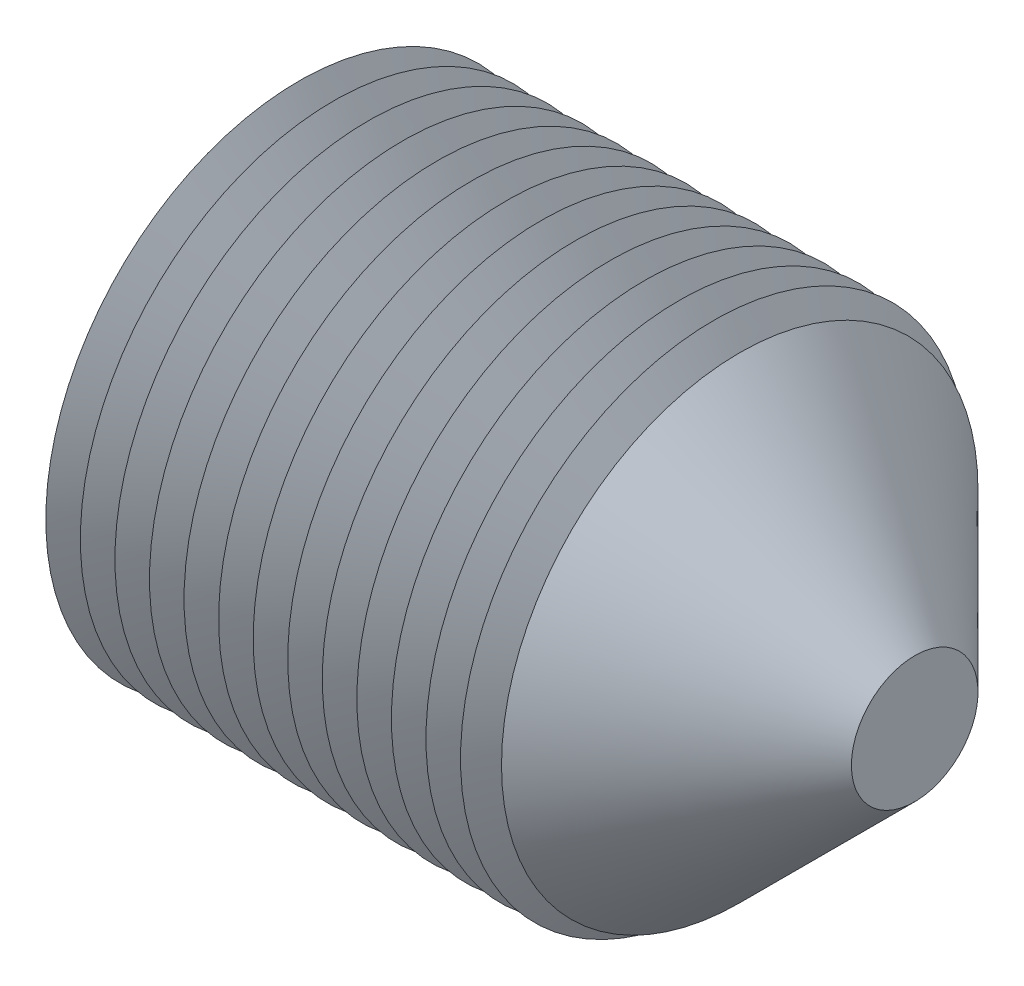
ISO-10303-21;
HEADER;
FILE_DESCRIPTION(('STEP AP214'),'2;1');
FILE_NAME('part.step','',(''),(''),'','','');
FILE_SCHEMA(('AUTOMOTIVE_DESIGN { 1 0 10303 214 1 1 1 1 }'));
ENDSEC;
DATA;
#1=APPLICATION_CONTEXT('core data for automotive mechanical design processes');
#2=APPLICATION_PROTOCOL_DEFINITION('international standard','automotive_design',2000,#1);
#3=PRODUCT_CONTEXT('',#1,'mechanical');
#4=PRODUCT('Part','Part','',(#3));
#5=PRODUCT_RELATED_PRODUCT_CATEGORY('part','',(#4));
#6=PRODUCT_DEFINITION_FORMATION('','',#4);
#7=PRODUCT_DEFINITION_CONTEXT('part definition',#1,'design');
#8=PRODUCT_DEFINITION('design','',#6,#7);
#9=PRODUCT_DEFINITION_SHAPE('','',#8);
#10=(LENGTH_UNIT() NAMED_UNIT(*) SI_UNIT(.MILLI.,.METRE.));
#11=(NAMED_UNIT(*) PLANE_ANGLE_UNIT() SI_UNIT($,.RADIAN.));
#12=(NAMED_UNIT(*) SI_UNIT($,.STERADIAN.) SOLID_ANGLE_UNIT());
#13=UNCERTAINTY_MEASURE_WITH_UNIT(LENGTH_MEASURE(1.E-05),#10,'distance_accuracy_value','');
#14=(GEOMETRIC_REPRESENTATION_CONTEXT(3) GLOBAL_UNCERTAINTY_ASSIGNED_CONTEXT((#13)) GLOBAL_UNIT_ASSIGNED_CONTEXT((#10,
#11,#12)) REPRESENTATION_CONTEXT('',''));
#15=CARTESIAN_POINT('',(0.,0.,0.));
#16=DIRECTION('',(0.,0.,1.));
#17=DIRECTION('',(1.,0.,0.));
#18=AXIS2_PLACEMENT_3D('',#15,#16,#17);
#19=CARTESIAN_POINT('',(10.,1.,0.));
#20=DIRECTION('',(1.,0.,0.));
#21=DIRECTION('',(0.,0.,-1.));
#22=AXIS2_PLACEMENT_3D('',#19,#20,#21);
#23=PLANE('',#22);
#24=CARTESIAN_POINT('',(10.,0.,0.));
#25=DIRECTION('',(1.,0.,0.));
#26=DIRECTION('',(0.,0.,-1.));
#27=AXIS2_PLACEMENT_3D('',#24,#25,#26);
#28=CIRCLE('',#27,1.);
#29=CARTESIAN_POINT('',(10.,0.,1.));
#30=VERTEX_POINT('',#29);
#31=EDGE_CURVE('E124',#30,#30,#28,.T.);
#32=ORIENTED_EDGE('',*,*,#31,.T.);
#33=EDGE_LOOP('',(#32));
#34=FACE_BOUND('',#33,.T.);
#35=ADVANCED_FACE('F33',(#34),#23,.T.);
#36=CARTESIAN_POINT('',(0.,0.,0.));
#37=DIRECTION('',(-1.,0.,0.));
#38=DIRECTION('',(0.,0.,1.));
#39=AXIS2_PLACEMENT_3D('',#36,#37,#38);
#40=PLANE('',#39);
#41=CARTESIAN_POINT('',(0.,0.,0.));
#42=DIRECTION('',(1.,0.,0.));
#43=DIRECTION('',(0.,0.,-1.));
#44=AXIS2_PLACEMENT_3D('',#41,#42,#43);
#45=CIRCLE('',#44,3.5218770039603);
#46=CARTESIAN_POINT('',(0.,0.,-3.5218770039603));
#47=VERTEX_POINT('',#46);
#48=EDGE_CURVE('E10',#47,#47,#45,.T.);
#49=ORIENTED_EDGE('',*,*,#48,.F.);
#50=EDGE_LOOP('',(#49));
#51=FACE_BOUND('',#50,.T.);
#52=ADVANCED_FACE('F141',(#51),#40,.T.);
#53=CARTESIAN_POINT('',(0.272997582349263,0.,0.));
#54=DIRECTION('',(1.,0.,0.));
#55=DIRECTION('',(0.,0.,-1.));
#56=AXIS2_PLACEMENT_3D('',#53,#54,#55);
#57=CONICAL_SURFACE('',#56,4.00000000000003,1.05199014456083);
#58=ORIENTED_EDGE('',*,*,#48,.T.);
#59=EDGE_LOOP('',(#58));
#60=FACE_BOUND('',#59,.T.);
#61=CARTESIAN_POINT('',(0.272997582349263,0.,0.));
#62=DIRECTION('',(1.,0.,0.));
#63=DIRECTION('',(0.,0.,-1.));
#64=AXIS2_PLACEMENT_3D('',#61,#62,#63);
#65=CIRCLE('',#64,4.00000000000003);
#66=CARTESIAN_POINT('',(0.272997582349263,0.,-4.00000000000003));
#67=VERTEX_POINT('',#66);
#68=EDGE_CURVE('E39',#67,#67,#65,.T.);
#69=ORIENTED_EDGE('',*,*,#68,.F.);
#70=EDGE_LOOP('',(#69));
#71=FACE_BOUND('',#70,.T.);
#72=ADVANCED_FACE('F145',(#60,#71),#57,.T.);
#73=CARTESIAN_POINT('',(0.545995164698582,0.,0.));
#74=DIRECTION('',(-1.,0.,0.));
#75=DIRECTION('',(0.,0.,1.));
#76=AXIS2_PLACEMENT_3D('',#73,#74,#75);
#77=CONICAL_SURFACE('',#76,3.5218770039603,1.05199014456074);
#78=ORIENTED_EDGE('',*,*,#68,.T.);
#79=EDGE_LOOP('',(#78));
#80=FACE_BOUND('',#79,.T.);
#81=CARTESIAN_POINT('',(0.545995164698582,0.,0.));
#82=DIRECTION('',(1.,0.,0.));
#83=DIRECTION('',(0.,0.,-1.));
#84=AXIS2_PLACEMENT_3D('',#81,#82,#83);
#85=CIRCLE('',#84,3.5218770039603);
#86=CARTESIAN_POINT('',(0.545995164698582,0.,-3.5218770039603));
#87=VERTEX_POINT('',#86);
#88=EDGE_CURVE('E43',#87,#87,#85,.T.);
#89=ORIENTED_EDGE('',*,*,#88,.F.);
#90=EDGE_LOOP('',(#89));
#91=FACE_BOUND('',#90,.T.);
#92=ADVANCED_FACE('F150',(#80,#91),#77,.T.);
#93=CARTESIAN_POINT('',(0.818992747047843,0.,0.));
#94=DIRECTION('',(1.,0.,0.));
#95=DIRECTION('',(0.,0.,-1.));
#96=AXIS2_PLACEMENT_3D('',#93,#94,#95);
#97=CONICAL_SURFACE('',#96,4.00000000000003,1.05199014456083);
#98=ORIENTED_EDGE('',*,*,#88,.T.);
#99=EDGE_LOOP('',(#98));
#100=FACE_BOUND('',#99,.T.);
#101=CARTESIAN_POINT('',(0.818992747047843,0.,0.));
#102=DIRECTION('',(1.,0.,0.));
#103=DIRECTION('',(0.,0.,-1.));
#104=AXIS2_PLACEMENT_3D('',#101,#102,#103);
#105=CIRCLE('',#104,4.00000000000003);
#106=CARTESIAN_POINT('',(0.818992747047843,0.,-4.00000000000003));
#107=VERTEX_POINT('',#106);
#108=EDGE_CURVE('E47',#107,#107,#105,.T.);
#109=ORIENTED_EDGE('',*,*,#108,.F.);
#110=EDGE_LOOP('',(#109));
#111=FACE_BOUND('',#110,.T.);
#112=ADVANCED_FACE('F155',(#100,#111),#97,.T.);
#113=CARTESIAN_POINT('',(1.09199032939716,0.,0.));
#114=DIRECTION('',(-1.,0.,0.));
#115=DIRECTION('',(0.,0.,1.));
#116=AXIS2_PLACEMENT_3D('',#113,#114,#115);
#117=CONICAL_SURFACE('',#116,3.5218770039603,1.05199014456074);
#118=ORIENTED_EDGE('',*,*,#108,.T.);
#119=EDGE_LOOP('',(#118));
#120=FACE_BOUND('',#119,.T.);
#121=CARTESIAN_POINT('',(1.09199032939716,0.,0.));
#122=DIRECTION('',(1.,0.,0.));
#123=DIRECTION('',(0.,0.,-1.));
#124=AXIS2_PLACEMENT_3D('',#121,#122,#123);
#125=CIRCLE('',#124,3.5218770039603);
#126=CARTESIAN_POINT('',(1.09199032939716,0.,-3.5218770039603));
#127=VERTEX_POINT('',#126);
#128=EDGE_CURVE('E52',#127,#127,#125,.T.);
#129=ORIENTED_EDGE('',*,*,#128,.F.);
#130=EDGE_LOOP('',(#129));
#131=FACE_BOUND('',#130,.T.);
#132=ADVANCED_FACE('F158',(#120,#131),#117,.T.);
#133=CARTESIAN_POINT('',(1.36498791174642,0.,0.));
#134=DIRECTION('',(1.,0.,0.));
#135=DIRECTION('',(0.,0.,-1.));
#136=AXIS2_PLACEMENT_3D('',#133,#134,#135);
#137=CONICAL_SURFACE('',#136,4.00000000000003,1.05199014456083);
#138=ORIENTED_EDGE('',*,*,#128,.T.);
#139=EDGE_LOOP('',(#138));
#140=FACE_BOUND('',#139,.T.);
#141=CARTESIAN_POINT('',(1.36498791174642,0.,0.));
#142=DIRECTION('',(1.,0.,0.));
#143=DIRECTION('',(0.,0.,-1.));
#144=AXIS2_PLACEMENT_3D('',#141,#142,#143);
#145=CIRCLE('',#144,4.00000000000003);
#146=CARTESIAN_POINT('',(1.36498791174642,0.,-4.00000000000003));
#147=VERTEX_POINT('',#146);
#148=EDGE_CURVE('E55',#147,#147,#145,.T.);
#149=ORIENTED_EDGE('',*,*,#148,.F.);
#150=EDGE_LOOP('',(#149));
#151=FACE_BOUND('',#150,.T.);
#152=ADVANCED_FACE('F162',(#140,#151),#137,.T.);
#153=CARTESIAN_POINT('',(1.63798549409575,0.,0.));
#154=DIRECTION('',(-1.,0.,0.));
#155=DIRECTION('',(0.,0.,1.));
#156=AXIS2_PLACEMENT_3D('',#153,#154,#155);
#157=CONICAL_SURFACE('',#156,3.5218770039603,1.05199014456074);
#158=ORIENTED_EDGE('',*,*,#148,.T.);
#159=EDGE_LOOP('',(#158));
#160=FACE_BOUND('',#159,.T.);
#161=CARTESIAN_POINT('',(1.63798549409575,0.,0.));
#162=DIRECTION('',(1.,0.,0.));
#163=DIRECTION('',(0.,0.,-1.));
#164=AXIS2_PLACEMENT_3D('',#161,#162,#163);
#165=CIRCLE('',#164,3.5218770039603);
#166=CARTESIAN_POINT('',(1.63798549409575,0.,-3.5218770039603));
#167=VERTEX_POINT('',#166);
#168=EDGE_CURVE('E58',#167,#167,#165,.T.);
#169=ORIENTED_EDGE('',*,*,#168,.F.);
#170=EDGE_LOOP('',(#169));
#171=FACE_BOUND('',#170,.T.);
#172=ADVANCED_FACE('F166',(#160,#171),#157,.T.);
#173=CARTESIAN_POINT('',(1.91098307644501,0.,0.));
#174=DIRECTION('',(1.,0.,0.));
#175=DIRECTION('',(0.,0.,-1.));
#176=AXIS2_PLACEMENT_3D('',#173,#174,#175);
#177=CONICAL_SURFACE('',#176,4.00000000000003,1.05199014456083);
#178=ORIENTED_EDGE('',*,*,#168,.T.);
#179=EDGE_LOOP('',(#178));
#180=FACE_BOUND('',#179,.T.);
#181=CARTESIAN_POINT('',(1.91098307644501,0.,0.));
#182=DIRECTION('',(1.,0.,0.));
#183=DIRECTION('',(0.,0.,-1.));
#184=AXIS2_PLACEMENT_3D('',#181,#182,#183);
#185=CIRCLE('',#184,4.00000000000003);
#186=CARTESIAN_POINT('',(1.91098307644501,0.,-4.00000000000003));
#187=VERTEX_POINT('',#186);
#188=EDGE_CURVE('E61',#187,#187,#185,.T.);
#189=ORIENTED_EDGE('',*,*,#188,.F.);
#190=EDGE_LOOP('',(#189));
#191=FACE_BOUND('',#190,.T.);
#192=ADVANCED_FACE('F170',(#180,#191),#177,.T.);
#193=CARTESIAN_POINT('',(2.18398065879432,0.,0.));
#194=DIRECTION('',(-1.,0.,0.));
#195=DIRECTION('',(0.,0.,1.));
#196=AXIS2_PLACEMENT_3D('',#193,#194,#195);
#197=CONICAL_SURFACE('',#196,3.5218770039603,1.05199014456074);
#198=ORIENTED_EDGE('',*,*,#188,.T.);
#199=EDGE_LOOP('',(#198));
#200=FACE_BOUND('',#199,.T.);
#201=CARTESIAN_POINT('',(2.18398065879432,0.,0.));
#202=DIRECTION('',(1.,0.,0.));
#203=DIRECTION('',(0.,0.,-1.));
#204=AXIS2_PLACEMENT_3D('',#201,#202,#203);
#205=CIRCLE('',#204,3.5218770039603);
#206=CARTESIAN_POINT('',(2.18398065879432,0.,-3.5218770039603));
#207=VERTEX_POINT('',#206);
#208=EDGE_CURVE('E64',#207,#207,#205,.T.);
#209=ORIENTED_EDGE('',*,*,#208,.F.);
#210=EDGE_LOOP('',(#209));
#211=FACE_BOUND('',#210,.T.);
#212=ADVANCED_FACE('F174',(#200,#211),#197,.T.);
#213=CARTESIAN_POINT('',(2.45697824114359,0.,0.));
#214=DIRECTION('',(1.,0.,0.));
#215=DIRECTION('',(0.,0.,-1.));
#216=AXIS2_PLACEMENT_3D('',#213,#214,#215);
#217=CONICAL_SURFACE('',#216,4.00000000000003,1.05199014456083);
#218=ORIENTED_EDGE('',*,*,#208,.T.);
#219=EDGE_LOOP('',(#218));
#220=FACE_BOUND('',#219,.T.);
#221=CARTESIAN_POINT('',(2.45697824114359,0.,0.));
#222=DIRECTION('',(1.,0.,0.));
#223=DIRECTION('',(0.,0.,-1.));
#224=AXIS2_PLACEMENT_3D('',#221,#222,#223);
#225=CIRCLE('',#224,4.00000000000003);
#226=CARTESIAN_POINT('',(2.45697824114359,0.,-4.00000000000003));
#227=VERTEX_POINT('',#226);
#228=EDGE_CURVE('E67',#227,#227,#225,.T.);
#229=ORIENTED_EDGE('',*,*,#228,.F.);
#230=EDGE_LOOP('',(#229));
#231=FACE_BOUND('',#230,.T.);
#232=ADVANCED_FACE('F178',(#220,#231),#217,.T.);
#233=CARTESIAN_POINT('',(2.72997582349291,0.,0.));
#234=DIRECTION('',(-1.,0.,0.));
#235=DIRECTION('',(0.,0.,1.));
#236=AXIS2_PLACEMENT_3D('',#233,#234,#235);
#237=CONICAL_SURFACE('',#236,3.5218770039603,1.05199014456074);
#238=ORIENTED_EDGE('',*,*,#228,.T.);
#239=EDGE_LOOP('',(#238));
#240=FACE_BOUND('',#239,.T.);
#241=CARTESIAN_POINT('',(2.72997582349291,0.,0.));
#242=DIRECTION('',(1.,0.,0.));
#243=DIRECTION('',(0.,0.,-1.));
#244=AXIS2_PLACEMENT_3D('',#241,#242,#243);
#245=CIRCLE('',#244,3.5218770039603);
#246=CARTESIAN_POINT('',(2.72997582349291,0.,-3.5218770039603));
#247=VERTEX_POINT('',#246);
#248=EDGE_CURVE('E70',#247,#247,#245,.T.);
#249=ORIENTED_EDGE('',*,*,#248,.F.);
#250=EDGE_LOOP('',(#249));
#251=FACE_BOUND('',#250,.T.);
#252=ADVANCED_FACE('F182',(#240,#251),#237,.T.);
#253=CARTESIAN_POINT('',(3.00297340584217,0.,0.));
#254=DIRECTION('',(1.,0.,0.));
#255=DIRECTION('',(0.,0.,-1.));
#256=AXIS2_PLACEMENT_3D('',#253,#254,#255);
#257=CONICAL_SURFACE('',#256,4.00000000000003,1.05199014456083);
#258=ORIENTED_EDGE('',*,*,#248,.T.);
#259=EDGE_LOOP('',(#258));
#260=FACE_BOUND('',#259,.T.);
#261=CARTESIAN_POINT('',(3.00297340584217,0.,0.));
#262=DIRECTION('',(1.,0.,0.));
#263=DIRECTION('',(0.,0.,-1.));
#264=AXIS2_PLACEMENT_3D('',#261,#262,#263);
#265=CIRCLE('',#264,4.00000000000003);
#266=CARTESIAN_POINT('',(3.00297340584217,0.,-4.00000000000003));
#267=VERTEX_POINT('',#266);
#268=EDGE_CURVE('E73',#267,#267,#265,.T.);
#269=ORIENTED_EDGE('',*,*,#268,.F.);
#270=EDGE_LOOP('',(#269));
#271=FACE_BOUND('',#270,.T.);
#272=ADVANCED_FACE('F186',(#260,#271),#257,.T.);
#273=CARTESIAN_POINT('',(3.27597098819149,0.,0.));
#274=DIRECTION('',(-1.,0.,0.));
#275=DIRECTION('',(0.,0.,1.));
#276=AXIS2_PLACEMENT_3D('',#273,#274,#275);
#277=CONICAL_SURFACE('',#276,3.5218770039603,1.05199014456074);
#278=ORIENTED_EDGE('',*,*,#268,.T.);
#279=EDGE_LOOP('',(#278));
#280=FACE_BOUND('',#279,.T.);
#281=CARTESIAN_POINT('',(3.27597098819149,0.,0.));
#282=DIRECTION('',(1.,0.,0.));
#283=DIRECTION('',(0.,0.,-1.));
#284=AXIS2_PLACEMENT_3D('',#281,#282,#283);
#285=CIRCLE('',#284,3.5218770039603);
#286=CARTESIAN_POINT('',(3.27597098819149,0.,-3.5218770039603));
#287=VERTEX_POINT('',#286);
#288=EDGE_CURVE('E76',#287,#287,#285,.T.);
#289=ORIENTED_EDGE('',*,*,#288,.F.);
#290=EDGE_LOOP('',(#289));
#291=FACE_BOUND('',#290,.T.);
#292=ADVANCED_FACE('F190',(#280,#291),#277,.T.);
#293=CARTESIAN_POINT('',(3.54896857054075,0.,0.));
#294=DIRECTION('',(1.,0.,0.));
#295=DIRECTION('',(0.,0.,-1.));
#296=AXIS2_PLACEMENT_3D('',#293,#294,#295);
#297=CONICAL_SURFACE('',#296,4.00000000000003,1.05199014456083);
#298=ORIENTED_EDGE('',*,*,#288,.T.);
#299=EDGE_LOOP('',(#298));
#300=FACE_BOUND('',#299,.T.);
#301=CARTESIAN_POINT('',(3.54896857054075,0.,0.));
#302=DIRECTION('',(1.,0.,0.));
#303=DIRECTION('',(0.,0.,-1.));
#304=AXIS2_PLACEMENT_3D('',#301,#302,#303);
#305=CIRCLE('',#304,4.00000000000003);
#306=CARTESIAN_POINT('',(3.54896857054075,0.,-4.00000000000003));
#307=VERTEX_POINT('',#306);
#308=EDGE_CURVE('E79',#307,#307,#305,.T.);
#309=ORIENTED_EDGE('',*,*,#308,.F.);
#310=EDGE_LOOP('',(#309));
#311=FACE_BOUND('',#310,.T.);
#312=ADVANCED_FACE('F194',(#300,#311),#297,.T.);
#313=CARTESIAN_POINT('',(3.82196615289007,0.,0.));
#314=DIRECTION('',(-1.,0.,0.));
#315=DIRECTION('',(0.,0.,1.));
#316=AXIS2_PLACEMENT_3D('',#313,#314,#315);
#317=CONICAL_SURFACE('',#316,3.5218770039603,1.05199014456074);
#318=ORIENTED_EDGE('',*,*,#308,.T.);
#319=EDGE_LOOP('',(#318));
#320=FACE_BOUND('',#319,.T.);
#321=CARTESIAN_POINT('',(3.82196615289007,0.,0.));
#322=DIRECTION('',(1.,0.,0.));
#323=DIRECTION('',(0.,0.,-1.));
#324=AXIS2_PLACEMENT_3D('',#321,#322,#323);
#325=CIRCLE('',#324,3.5218770039603);
#326=CARTESIAN_POINT('',(3.82196615289007,0.,-3.5218770039603));
#327=VERTEX_POINT('',#326);
#328=EDGE_CURVE('E82',#327,#327,#325,.T.);
#329=ORIENTED_EDGE('',*,*,#328,.F.);
#330=EDGE_LOOP('',(#329));
#331=FACE_BOUND('',#330,.T.);
#332=ADVANCED_FACE('F198',(#320,#331),#317,.T.);
#333=CARTESIAN_POINT('',(4.09496373523933,0.,0.));
#334=DIRECTION('',(1.,0.,0.));
#335=DIRECTION('',(0.,0.,-1.));
#336=AXIS2_PLACEMENT_3D('',#333,#334,#335);
#337=CONICAL_SURFACE('',#336,4.00000000000003,1.05199014456083);
#338=ORIENTED_EDGE('',*,*,#328,.T.);
#339=EDGE_LOOP('',(#338));
#340=FACE_BOUND('',#339,.T.);
#341=CARTESIAN_POINT('',(4.09496373523933,0.,0.));
#342=DIRECTION('',(1.,0.,0.));
#343=DIRECTION('',(0.,0.,-1.));
#344=AXIS2_PLACEMENT_3D('',#341,#342,#343);
#345=CIRCLE('',#344,4.00000000000003);
#346=CARTESIAN_POINT('',(4.09496373523933,0.,-4.00000000000003));
#347=VERTEX_POINT('',#346);
#348=EDGE_CURVE('E85',#347,#347,#345,.T.);
#349=ORIENTED_EDGE('',*,*,#348,.F.);
#350=EDGE_LOOP('',(#349));
#351=FACE_BOUND('',#350,.T.);
#352=ADVANCED_FACE('F202',(#340,#351),#337,.T.);
#353=CARTESIAN_POINT('',(4.36796131758865,0.,0.));
#354=DIRECTION('',(-1.,0.,0.));
#355=DIRECTION('',(0.,0.,1.));
#356=AXIS2_PLACEMENT_3D('',#353,#354,#355);
#357=CONICAL_SURFACE('',#356,3.5218770039603,1.05199014456074);
#358=ORIENTED_EDGE('',*,*,#348,.T.);
#359=EDGE_LOOP('',(#358));
#360=FACE_BOUND('',#359,.T.);
#361=CARTESIAN_POINT('',(4.36796131758865,0.,0.));
#362=DIRECTION('',(1.,0.,0.));
#363=DIRECTION('',(0.,0.,-1.));
#364=AXIS2_PLACEMENT_3D('',#361,#362,#363);
#365=CIRCLE('',#364,3.5218770039603);
#366=CARTESIAN_POINT('',(4.36796131758865,0.,-3.5218770039603));
#367=VERTEX_POINT('',#366);
#368=EDGE_CURVE('E88',#367,#367,#365,.T.);
#369=ORIENTED_EDGE('',*,*,#368,.F.);
#370=EDGE_LOOP('',(#369));
#371=FACE_BOUND('',#370,.T.);
#372=ADVANCED_FACE('F206',(#360,#371),#357,.T.);
#373=CARTESIAN_POINT('',(4.64095889993791,0.,0.));
#374=DIRECTION('',(1.,0.,0.));
#375=DIRECTION('',(0.,0.,-1.));
#376=AXIS2_PLACEMENT_3D('',#373,#374,#375);
#377=CONICAL_SURFACE('',#376,4.00000000000003,1.05199014456083);
#378=ORIENTED_EDGE('',*,*,#368,.T.);
#379=EDGE_LOOP('',(#378));
#380=FACE_BOUND('',#379,.T.);
#381=CARTESIAN_POINT('',(4.64095889993791,0.,0.));
#382=DIRECTION('',(1.,0.,0.));
#383=DIRECTION('',(0.,0.,-1.));
#384=AXIS2_PLACEMENT_3D('',#381,#382,#383);
#385=CIRCLE('',#384,4.00000000000003);
#386=CARTESIAN_POINT('',(4.64095889993791,0.,-4.00000000000003));
#387=VERTEX_POINT('',#386);
#388=EDGE_CURVE('E91',#387,#387,#385,.T.);
#389=ORIENTED_EDGE('',*,*,#388,.F.);
#390=EDGE_LOOP('',(#389));
#391=FACE_BOUND('',#390,.T.);
#392=ADVANCED_FACE('F210',(#380,#391),#377,.T.);
#393=CARTESIAN_POINT('',(4.91395648228723,0.,0.));
#394=DIRECTION('',(-1.,0.,0.));
#395=DIRECTION('',(0.,0.,1.));
#396=AXIS2_PLACEMENT_3D('',#393,#394,#395);
#397=CONICAL_SURFACE('',#396,3.5218770039603,1.05199014456074);
#398=ORIENTED_EDGE('',*,*,#388,.T.);
#399=EDGE_LOOP('',(#398));
#400=FACE_BOUND('',#399,.T.);
#401=CARTESIAN_POINT('',(4.91395648228723,0.,0.));
#402=DIRECTION('',(1.,0.,0.));
#403=DIRECTION('',(0.,0.,-1.));
#404=AXIS2_PLACEMENT_3D('',#401,#402,#403);
#405=CIRCLE('',#404,3.5218770039603);
#406=CARTESIAN_POINT('',(4.91395648228723,0.,-3.5218770039603));
#407=VERTEX_POINT('',#406);
#408=EDGE_CURVE('E94',#407,#407,#405,.T.);
#409=ORIENTED_EDGE('',*,*,#408,.F.);
#410=EDGE_LOOP('',(#409));
#411=FACE_BOUND('',#410,.T.);
#412=ADVANCED_FACE('F214',(#400,#411),#397,.T.);
#413=CARTESIAN_POINT('',(5.1869540646365,0.,0.));
#414=DIRECTION('',(1.,0.,0.));
#415=DIRECTION('',(0.,0.,-1.));
#416=AXIS2_PLACEMENT_3D('',#413,#414,#415);
#417=CONICAL_SURFACE('',#416,4.00000000000003,1.05199014456083);
#418=ORIENTED_EDGE('',*,*,#408,.T.);
#419=EDGE_LOOP('',(#418));
#420=FACE_BOUND('',#419,.T.);
#421=CARTESIAN_POINT('',(5.1869540646365,0.,0.));
#422=DIRECTION('',(1.,0.,0.));
#423=DIRECTION('',(0.,0.,-1.));
#424=AXIS2_PLACEMENT_3D('',#421,#422,#423);
#425=CIRCLE('',#424,4.00000000000003);
#426=CARTESIAN_POINT('',(5.1869540646365,0.,-4.00000000000003));
#427=VERTEX_POINT('',#426);
#428=EDGE_CURVE('E97',#427,#427,#425,.T.);
#429=ORIENTED_EDGE('',*,*,#428,.F.);
#430=EDGE_LOOP('',(#429));
#431=FACE_BOUND('',#430,.T.);
#432=ADVANCED_FACE('F218',(#420,#431),#417,.T.);
#433=CARTESIAN_POINT('',(5.45995164698582,0.,0.));
#434=DIRECTION('',(-1.,0.,0.));
#435=DIRECTION('',(0.,0.,1.));
#436=AXIS2_PLACEMENT_3D('',#433,#434,#435);
#437=CONICAL_SURFACE('',#436,3.5218770039603,1.05199014456074);
#438=ORIENTED_EDGE('',*,*,#428,.T.);
#439=EDGE_LOOP('',(#438));
#440=FACE_BOUND('',#439,.T.);
#441=CARTESIAN_POINT('',(5.45995164698582,0.,0.));
#442=DIRECTION('',(1.,0.,0.));
#443=DIRECTION('',(0.,0.,-1.));
#444=AXIS2_PLACEMENT_3D('',#441,#442,#443);
#445=CIRCLE('',#444,3.5218770039603);
#446=CARTESIAN_POINT('',(5.45995164698582,0.,-3.5218770039603));
#447=VERTEX_POINT('',#446);
#448=EDGE_CURVE('E100',#447,#447,#445,.T.);
#449=ORIENTED_EDGE('',*,*,#448,.F.);
#450=EDGE_LOOP('',(#449));
#451=FACE_BOUND('',#450,.T.);
#452=ADVANCED_FACE('F222',(#440,#451),#437,.T.);
#453=CARTESIAN_POINT('',(5.73294922933508,0.,0.));
#454=DIRECTION('',(1.,0.,0.));
#455=DIRECTION('',(0.,0.,-1.));
#456=AXIS2_PLACEMENT_3D('',#453,#454,#455);
#457=CONICAL_SURFACE('',#456,4.00000000000003,1.05199014456083);
#458=ORIENTED_EDGE('',*,*,#448,.T.);
#459=EDGE_LOOP('',(#458));
#460=FACE_BOUND('',#459,.T.);
#461=CARTESIAN_POINT('',(5.73294922933508,0.,0.));
#462=DIRECTION('',(1.,0.,0.));
#463=DIRECTION('',(0.,0.,-1.));
#464=AXIS2_PLACEMENT_3D('',#461,#462,#463);
#465=CIRCLE('',#464,4.00000000000003);
#466=CARTESIAN_POINT('',(5.73294922933508,0.,-4.00000000000003));
#467=VERTEX_POINT('',#466);
#468=EDGE_CURVE('E103',#467,#467,#465,.T.);
#469=ORIENTED_EDGE('',*,*,#468,.F.);
#470=EDGE_LOOP('',(#469));
#471=FACE_BOUND('',#470,.T.);
#472=ADVANCED_FACE('F226',(#460,#471),#457,.T.);
#473=CARTESIAN_POINT('',(6.0059468116844,0.,0.));
#474=DIRECTION('',(-1.,0.,0.));
#475=DIRECTION('',(0.,0.,1.));
#476=AXIS2_PLACEMENT_3D('',#473,#474,#475);
#477=CONICAL_SURFACE('',#476,3.5218770039603,1.05199014456074);
#478=ORIENTED_EDGE('',*,*,#468,.T.);
#479=EDGE_LOOP('',(#478));
#480=FACE_BOUND('',#479,.T.);
#481=CARTESIAN_POINT('',(6.0059468116844,0.,0.));
#482=DIRECTION('',(1.,0.,0.));
#483=DIRECTION('',(0.,0.,-1.));
#484=AXIS2_PLACEMENT_3D('',#481,#482,#483);
#485=CIRCLE('',#484,3.5218770039603);
#486=CARTESIAN_POINT('',(6.0059468116844,0.,-3.5218770039603));
#487=VERTEX_POINT('',#486);
#488=EDGE_CURVE('E106',#487,#487,#485,.T.);
#489=ORIENTED_EDGE('',*,*,#488,.F.);
#490=EDGE_LOOP('',(#489));
#491=FACE_BOUND('',#490,.T.);
#492=ADVANCED_FACE('F230',(#480,#491),#477,.T.);
#493=CARTESIAN_POINT('',(6.27894439403366,0.,0.));
#494=DIRECTION('',(1.,0.,0.));
#495=DIRECTION('',(0.,0.,-1.));
#496=AXIS2_PLACEMENT_3D('',#493,#494,#495);
#497=CONICAL_SURFACE('',#496,4.00000000000003,1.05199014456083);
#498=ORIENTED_EDGE('',*,*,#488,.T.);
#499=EDGE_LOOP('',(#498));
#500=FACE_BOUND('',#499,.T.);
#501=CARTESIAN_POINT('',(6.27894439403366,0.,0.));
#502=DIRECTION('',(1.,0.,0.));
#503=DIRECTION('',(0.,0.,-1.));
#504=AXIS2_PLACEMENT_3D('',#501,#502,#503);
#505=CIRCLE('',#504,4.00000000000003);
#506=CARTESIAN_POINT('',(6.27894439403366,0.,-4.00000000000003));
#507=VERTEX_POINT('',#506);
#508=EDGE_CURVE('E109',#507,#507,#505,.T.);
#509=ORIENTED_EDGE('',*,*,#508,.F.);
#510=EDGE_LOOP('',(#509));
#511=FACE_BOUND('',#510,.T.);
#512=ADVANCED_FACE('F234',(#500,#511),#497,.T.);
#513=CARTESIAN_POINT('',(6.55194197638298,0.,0.));
#514=DIRECTION('',(-1.,0.,0.));
#515=DIRECTION('',(0.,0.,1.));
#516=AXIS2_PLACEMENT_3D('',#513,#514,#515);
#517=CONICAL_SURFACE('',#516,3.5218770039603,1.05199014456074);
#518=ORIENTED_EDGE('',*,*,#508,.T.);
#519=EDGE_LOOP('',(#518));
#520=FACE_BOUND('',#519,.T.);
#521=CARTESIAN_POINT('',(6.55194197638298,0.,0.));
#522=DIRECTION('',(1.,0.,0.));
#523=DIRECTION('',(0.,0.,-1.));
#524=AXIS2_PLACEMENT_3D('',#521,#522,#523);
#525=CIRCLE('',#524,3.5218770039603);
#526=CARTESIAN_POINT('',(6.55194197638298,0.,-3.5218770039603));
#527=VERTEX_POINT('',#526);
#528=EDGE_CURVE('E112',#527,#527,#525,.T.);
#529=ORIENTED_EDGE('',*,*,#528,.F.);
#530=EDGE_LOOP('',(#529));
#531=FACE_BOUND('',#530,.T.);
#532=ADVANCED_FACE('F238',(#520,#531),#517,.T.);
#533=CARTESIAN_POINT('',(6.82493955873224,0.,0.));
#534=DIRECTION('',(1.,0.,0.));
#535=DIRECTION('',(0.,0.,-1.));
#536=AXIS2_PLACEMENT_3D('',#533,#534,#535);
#537=CONICAL_SURFACE('',#536,4.00000000000003,1.05199014456083);
#538=ORIENTED_EDGE('',*,*,#528,.T.);
#539=EDGE_LOOP('',(#538));
#540=FACE_BOUND('',#539,.T.);
#541=CARTESIAN_POINT('',(6.82493955873224,0.,0.));
#542=DIRECTION('',(1.,0.,0.));
#543=DIRECTION('',(0.,0.,-1.));
#544=AXIS2_PLACEMENT_3D('',#541,#542,#543);
#545=CIRCLE('',#544,4.00000000000003);
#546=CARTESIAN_POINT('',(6.82493955873224,0.,-4.00000000000003));
#547=VERTEX_POINT('',#546);
#548=EDGE_CURVE('E115',#547,#547,#545,.T.);
#549=ORIENTED_EDGE('',*,*,#548,.F.);
#550=EDGE_LOOP('',(#549));
#551=FACE_BOUND('',#550,.T.);
#552=ADVANCED_FACE('F242',(#540,#551),#537,.T.);
#553=CARTESIAN_POINT('',(7.09793714108156,0.,0.));
#554=DIRECTION('',(-1.,0.,0.));
#555=DIRECTION('',(0.,0.,1.));
#556=AXIS2_PLACEMENT_3D('',#553,#554,#555);
#557=CONICAL_SURFACE('',#556,3.5218770039603,1.05199014456074);
#558=ORIENTED_EDGE('',*,*,#548,.T.);
#559=EDGE_LOOP('',(#558));
#560=FACE_BOUND('',#559,.T.);
#561=CARTESIAN_POINT('',(7.09793714108156,0.,0.));
#562=DIRECTION('',(1.,0.,0.));
#563=DIRECTION('',(0.,0.,-1.));
#564=AXIS2_PLACEMENT_3D('',#561,#562,#563);
#565=CIRCLE('',#564,3.5218770039603);
#566=CARTESIAN_POINT('',(7.09793714108156,0.,-3.5218770039603));
#567=VERTEX_POINT('',#566);
#568=EDGE_CURVE('E118',#567,#567,#565,.T.);
#569=ORIENTED_EDGE('',*,*,#568,.F.);
#570=EDGE_LOOP('',(#569));
#571=FACE_BOUND('',#570,.T.);
#572=ADVANCED_FACE('F137',(#560,#571),#557,.T.);
#573=CARTESIAN_POINT('',(7.2361171114261,0.,0.));
#574=DIRECTION('',(1.,0.,0.));
#575=DIRECTION('',(0.,0.,-1.));
#576=AXIS2_PLACEMENT_3D('',#573,#574,#575);
#577=CONICAL_SURFACE('',#576,3.7638828885739,1.05199014456081);
#578=ORIENTED_EDGE('',*,*,#568,.T.);
#579=EDGE_LOOP('',(#578));
#580=FACE_BOUND('',#579,.T.);
#581=CARTESIAN_POINT('',(7.2361171114261,0.,0.));
#582=DIRECTION('',(1.,0.,0.));
#583=DIRECTION('',(0.,0.,-1.));
#584=AXIS2_PLACEMENT_3D('',#581,#582,#583);
#585=CIRCLE('',#584,3.7638828885739);
#586=CARTESIAN_POINT('',(7.2361171114261,0.,3.7638828885739));
#587=VERTEX_POINT('',#586);
#588=EDGE_CURVE('E121',#587,#587,#585,.T.);
#589=ORIENTED_EDGE('',*,*,#588,.F.);
#590=EDGE_LOOP('',(#589));
#591=FACE_BOUND('',#590,.T.);
#592=ADVANCED_FACE('F131',(#580,#591),#577,.T.);
#593=CARTESIAN_POINT('',(10.,0.,0.));
#594=DIRECTION('',(-1.,0.,0.));
#595=DIRECTION('',(0.,0.,1.));
#596=AXIS2_PLACEMENT_3D('',#593,#594,#595);
#597=CONICAL_SURFACE('',#596,1.,0.785398163397448);
#598=CARTESIAN_POINT('',(7.2361171114261,0.,3.7638828885739));
#599=CARTESIAN_POINT('',(7.26490755818208,0.,3.73509244181792));
#600=CARTESIAN_POINT('',(7.29369800493805,0.,3.70630199506195));
#601=CARTESIAN_POINT('',(7.35127889845001,0.,3.64872110154999));
#602=CARTESIAN_POINT('',(7.38006934520599,0.,3.61993065479401));
#603=CARTESIAN_POINT('',(7.43765023871794,0.,3.56234976128206));
#604=CARTESIAN_POINT('',(7.46644068547392,0.,3.53355931452608));
#605=CARTESIAN_POINT('',(7.52402157898588,0.,3.47597842101412));
#606=CARTESIAN_POINT('',(7.55281202574186,0.,3.44718797425814));
#607=CARTESIAN_POINT('',(7.61039291925381,0.,3.38960708074619));
#608=CARTESIAN_POINT('',(7.63918336600979,0.,3.36081663399021));
#609=CARTESIAN_POINT('',(7.69676425952175,0.,3.30323574047825));
#610=CARTESIAN_POINT('',(7.72555470627773,0.,3.27444529372227));
#611=CARTESIAN_POINT('',(7.78313559978968,0.,3.21686440021032));
#612=CARTESIAN_POINT('',(7.81192604654566,0.,3.18807395345434));
#613=CARTESIAN_POINT('',(7.86950694005762,0.,3.13049305994238));
#614=CARTESIAN_POINT('',(7.89829738681359,0.,3.10170261318641));
#615=CARTESIAN_POINT('',(7.95587828032555,0.,3.04412171967445));
#616=CARTESIAN_POINT('',(7.98466872708153,0.,3.01533127291847));
#617=CARTESIAN_POINT('',(8.04224962059349,0.,2.95775037940651));
#618=CARTESIAN_POINT('',(8.07104006734946,0.,2.92895993265054));
#619=CARTESIAN_POINT('',(8.12862096086142,0.,2.87137903913858));
#620=CARTESIAN_POINT('',(8.1574114076174,0.,2.8425885923826));
#621=CARTESIAN_POINT('',(8.21499230112935,0.,2.78500769887065));
#622=CARTESIAN_POINT('',(8.24378274788533,0.,2.75621725211467));
#623=CARTESIAN_POINT('',(8.30136364139729,0.,2.69863635860271));
#624=CARTESIAN_POINT('',(8.33015408815327,0.,2.66984591184673));
#625=CARTESIAN_POINT('',(8.38773498166522,0.,2.61226501833478));
#626=CARTESIAN_POINT('',(8.4165254284212,0.,2.5834745715788));
#627=CARTESIAN_POINT('',(8.47410632193316,0.,2.52589367806684));
#628=CARTESIAN_POINT('',(8.50289676868913,0.,2.49710323131086));
#629=CARTESIAN_POINT('',(8.56047766220109,0.,2.43952233779891));
#630=CARTESIAN_POINT('',(8.58926810895707,0.,2.41073189104293));
#631=CARTESIAN_POINT('',(8.64684900246903,0.,2.35315099753097));
#632=CARTESIAN_POINT('',(8.675639449225,0.,2.324360550775));
#633=CARTESIAN_POINT('',(8.73322034273696,0.,2.26677965726304));
#634=CARTESIAN_POINT('',(8.76201078949294,0.,2.23798921050706));
#635=CARTESIAN_POINT('',(8.8195916830049,0.,2.1804083169951));
#636=CARTESIAN_POINT('',(8.84838212976087,0.,2.15161787023913));
#637=CARTESIAN_POINT('',(8.90596302327283,0.,2.09403697672717));
#638=CARTESIAN_POINT('',(8.93475347002881,0.,2.06524652997119));
#639=CARTESIAN_POINT('',(8.99233436354077,0.,2.00766563645924));
#640=CARTESIAN_POINT('',(9.02112481029674,0.,1.97887518970326));
#641=CARTESIAN_POINT('',(9.0787057038087,0.,1.9212942961913));
#642=CARTESIAN_POINT('',(9.10749615056468,0.,1.89250384943532));
#643=CARTESIAN_POINT('',(9.16507704407663,0.,1.83492295592337));
#644=CARTESIAN_POINT('',(9.19386749083261,0.,1.80613250916739));
#645=CARTESIAN_POINT('',(9.25144838434457,0.,1.74855161565543));
#646=CARTESIAN_POINT('',(9.28023883110055,0.,1.71976116889945));
#647=CARTESIAN_POINT('',(9.3378197246125,0.,1.6621802753875));
#648=CARTESIAN_POINT('',(9.36661017136848,0.,1.63338982863152));
#649=CARTESIAN_POINT('',(9.42419106488044,0.,1.57580893511956));
#650=CARTESIAN_POINT('',(9.45298151163641,0.,1.54701848836359));
#651=CARTESIAN_POINT('',(9.51056240514837,0.,1.48943759485163));
#652=CARTESIAN_POINT('',(9.53935285190435,0.,1.46064714809565));
#653=CARTESIAN_POINT('',(9.5969337454163,0.,1.40306625458369));
#654=CARTESIAN_POINT('',(9.62572419217228,0.,1.37427580782772));
#655=CARTESIAN_POINT('',(9.68330508568424,0.,1.31669491431576));
#656=CARTESIAN_POINT('',(9.71209553244022,0.,1.28790446755978));
#657=CARTESIAN_POINT('',(9.76967642595217,0.,1.23032357404783));
#658=CARTESIAN_POINT('',(9.79846687270815,0.,1.20153312729185));
#659=CARTESIAN_POINT('',(9.85604776622011,0.,1.14395223377989));
#660=CARTESIAN_POINT('',(9.88483821297609,0.,1.11516178702391));
#661=CARTESIAN_POINT('',(9.94241910648804,0.,1.05758089351196));
#662=CARTESIAN_POINT('',(9.97120955324402,0.,1.02879044675598));
#663=CARTESIAN_POINT('',(10.,0.,1.));
#664=B_SPLINE_CURVE_WITH_KNOTS('',3,(#598,#599,#600,#601,#602,#603,#604,#605,#606,#607,#608,
#609,#610,#611,#612,#613,#614,#615,#616,#617,#618,#619,#620,#621,#622,#623,#624,#625,#626,#627,
#628,#629,#630,#631,#632,#633,#634,#635,#636,#637,#638,#639,#640,#641,#642,#643,#644,#645,#646,
#647,#648,#649,#650,#651,#652,#653,#654,#655,#656,#657,#658,#659,#660,#661,#662,#663),
.UNSPECIFIED.,.F.,.F.,(4,2,2,2,2,2,2,2,2,2,2,2,2,2,2,2,2,2,2,2,2,2,2,2,2,2,2,2,2,2,2,2,4),(0.,
0.122147520807254,0.244295041614509,0.366442562421763,0.488590083229018,0.610737604036272,
0.732885124843525,0.855032645650781,0.977180166458034,1.09932768726529,1.22147520807254,
1.3436227288798,1.46577024968705,1.58791777049431,1.71006529130156,1.83221281210881,
1.95436033291607,2.07650785372332,2.19865537453058,2.32080289533783,2.44295041614509,
2.56509793695234,2.68724545775959,2.80939297856685,2.9315404993741,3.05368802018136,
3.17583554098861,3.29798306179587,3.42013058260312,3.54227810341037,3.66442562421763,
3.78657314502488,3.90872066583214),.UNSPECIFIED.);
#665=EDGE_CURVE('BSEAM129',#587,#30,#664,.T.);
#666=ORIENTED_EDGE('',*,*,#588,.T.);
#667=ORIENTED_EDGE('',*,*,#31,.F.);
#668=ORIENTED_EDGE('',*,*,#665,.T.);
#669=ORIENTED_EDGE('',*,*,#665,.F.);
#670=EDGE_LOOP('',(#666,#668,#667,#669));
#671=FACE_BOUND('',#670,.T.);
#672=ADVANCED_FACE('F129',(#671),#597,.T.);
#673=CLOSED_SHELL('',(#35,#52,#72,#92,#112,#132,#152,#172,#192,#212,#232,#252,#272,#292,#312,
#332,#352,#372,#392,#412,#432,#452,#472,#492,#512,#532,#552,#572,#592,#672));
#674=MANIFOLD_SOLID_BREP('B2',#673);
#675=ADVANCED_BREP_SHAPE_REPRESENTATION('',(#18,#674),#14);
#676=SHAPE_DEFINITION_REPRESENTATION(#9,#675);
ENDSEC;
END-ISO-10303-21;
